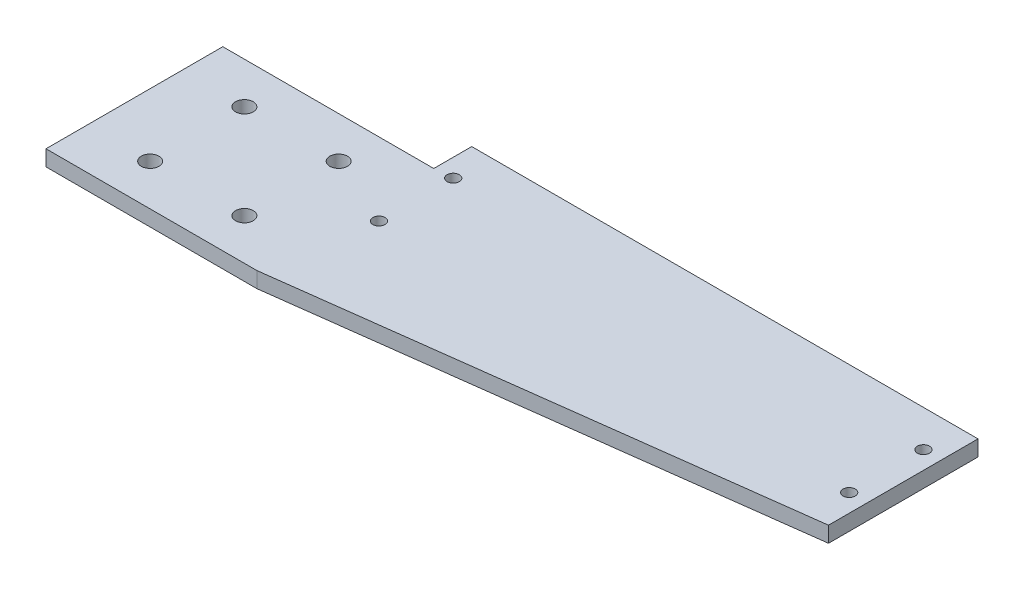
ISO-10303-21;
HEADER;
FILE_DESCRIPTION(('STEP AP214'),'2;1');
FILE_NAME('part.step','',(''),(''),'','','');
FILE_SCHEMA(('AUTOMOTIVE_DESIGN { 1 0 10303 214 1 1 1 1 }'));
ENDSEC;
DATA;
#1=APPLICATION_CONTEXT('core data for automotive mechanical design processes');
#2=APPLICATION_PROTOCOL_DEFINITION('international standard','automotive_design',2000,#1);
#3=PRODUCT_CONTEXT('',#1,'mechanical');
#4=PRODUCT('Part','Part','',(#3));
#5=PRODUCT_RELATED_PRODUCT_CATEGORY('part','',(#4));
#6=PRODUCT_DEFINITION_FORMATION('','',#4);
#7=PRODUCT_DEFINITION_CONTEXT('part definition',#1,'design');
#8=PRODUCT_DEFINITION('design','',#6,#7);
#9=PRODUCT_DEFINITION_SHAPE('','',#8);
#10=(LENGTH_UNIT() NAMED_UNIT(*) SI_UNIT(.MILLI.,.METRE.));
#11=(NAMED_UNIT(*) PLANE_ANGLE_UNIT() SI_UNIT($,.RADIAN.));
#12=(NAMED_UNIT(*) SI_UNIT($,.STERADIAN.) SOLID_ANGLE_UNIT());
#13=UNCERTAINTY_MEASURE_WITH_UNIT(LENGTH_MEASURE(1.E-05),#10,'distance_accuracy_value','');
#14=(GEOMETRIC_REPRESENTATION_CONTEXT(3) GLOBAL_UNCERTAINTY_ASSIGNED_CONTEXT((#13)) GLOBAL_UNIT_ASSIGNED_CONTEXT((#10,
#11,#12)) REPRESENTATION_CONTEXT('',''));
#15=CARTESIAN_POINT('',(0.,0.,0.));
#16=DIRECTION('',(0.,0.,1.));
#17=DIRECTION('',(1.,0.,0.));
#18=AXIS2_PLACEMENT_3D('',#15,#16,#17);
#19=CARTESIAN_POINT('',(102.286,31.3499999999993,-45.0608293227095));
#20=DIRECTION('',(-1.,0.,0.));
#21=DIRECTION('',(0.,-1.,0.));
#22=AXIS2_PLACEMENT_3D('',#19,#20,#21);
#23=PLANE('',#22);
#24=DIRECTION('',(0.,0.,-1.));
#25=VECTOR('',#24,1.);
#26=CARTESIAN_POINT('',(102.286,31.3499999999991,-0.793749999999887));
#27=LINE('',#26,#25);
#28=CARTESIAN_POINT('',(102.286,31.35,1.12088089124449E-13));
#29=VERTEX_POINT('',#28);
#30=CARTESIAN_POINT('',(102.286,31.3499999999994,-60.40625));
#31=VERTEX_POINT('',#30);
#32=EDGE_CURVE('E71',#29,#31,#27,.T.);
#33=ORIENTED_EDGE('',*,*,#32,.F.);
#34=DIRECTION('',(0.,-1.,0.));
#35=VECTOR('',#34,1.);
#36=CARTESIAN_POINT('',(102.286,31.35,1.12088089124449E-13));
#37=LINE('',#36,#35);
#38=CARTESIAN_POINT('',(102.286,24.9999999999991,0.));
#39=VERTEX_POINT('',#38);
#40=EDGE_CURVE('E154',#29,#39,#37,.T.);
#41=ORIENTED_EDGE('',*,*,#40,.T.);
#42=DIRECTION('',(0.,0.,-1.));
#43=VECTOR('',#42,1.);
#44=CARTESIAN_POINT('',(102.286,24.9999999999993,-45.0608293227096));
#45=LINE('',#44,#43);
#46=CARTESIAN_POINT('',(102.286,24.9999999999993,-60.40625));
#47=VERTEX_POINT('',#46);
#48=EDGE_CURVE('E110',#39,#47,#45,.T.);
#49=ORIENTED_EDGE('',*,*,#48,.T.);
#50=DIRECTION('',(0.,-1.,0.));
#51=VECTOR('',#50,1.);
#52=CARTESIAN_POINT('',(102.286,31.3499999999994,-60.40625));
#53=LINE('',#52,#51);
#54=EDGE_CURVE('E25',#31,#47,#53,.T.);
#55=ORIENTED_EDGE('',*,*,#54,.F.);
#56=EDGE_LOOP('',(#33,#41,#49,#55));
#57=FACE_BOUND('',#56,.T.);
#58=ADVANCED_FACE('F17',(#57),#23,.F.);
#59=CARTESIAN_POINT('',(102.286,31.3499999999994,-60.40625));
#60=DIRECTION('',(0.,0.,1.));
#61=DIRECTION('',(0.,-1.,0.));
#62=AXIS2_PLACEMENT_3D('',#59,#60,#61);
#63=PLANE('',#62);
#64=DIRECTION('',(-1.,0.,0.));
#65=VECTOR('',#64,1.);
#66=CARTESIAN_POINT('',(102.286,24.9999999999993,-60.40625));
#67=LINE('',#66,#65);
#68=CARTESIAN_POINT('',(-102.286,24.9999999999993,-60.40625));
#69=VERTEX_POINT('',#68);
#70=EDGE_CURVE('E112',#47,#69,#67,.T.);
#71=ORIENTED_EDGE('',*,*,#70,.T.);
#72=DIRECTION('',(0.,-1.,0.));
#73=VECTOR('',#72,1.);
#74=CARTESIAN_POINT('',(-102.286,31.3499999999993,-60.40625));
#75=LINE('',#74,#73);
#76=CARTESIAN_POINT('',(-102.286,31.3499999999993,-60.40625));
#77=VERTEX_POINT('',#76);
#78=EDGE_CURVE('E99',#77,#69,#75,.T.);
#79=ORIENTED_EDGE('',*,*,#78,.F.);
#80=DIRECTION('',(-1.,0.,0.));
#81=VECTOR('',#80,1.);
#82=CARTESIAN_POINT('',(102.286,31.3499999999994,-60.40625));
#83=LINE('',#82,#81);
#84=EDGE_CURVE('E86',#31,#77,#83,.T.);
#85=ORIENTED_EDGE('',*,*,#84,.F.);
#86=ORIENTED_EDGE('',*,*,#54,.T.);
#87=EDGE_LOOP('',(#71,#79,#85,#86));
#88=FACE_BOUND('',#87,.T.);
#89=ADVANCED_FACE('F227',(#88),#63,.F.);
#90=CARTESIAN_POINT('',(-102.286,31.3499999999993,-45.0608293227095));
#91=DIRECTION('',(1.,0.,0.));
#92=DIRECTION('',(0.,1.,0.));
#93=AXIS2_PLACEMENT_3D('',#90,#91,#92);
#94=PLANE('',#93);
#95=DIRECTION('',(0.,0.,1.));
#96=VECTOR('',#95,1.);
#97=CARTESIAN_POINT('',(-102.286,24.9999999999992,-45.0608293227096));
#98=LINE('',#97,#96);
#99=CARTESIAN_POINT('',(-102.286,24.9999999999992,-45.0608293227096));
#100=VERTEX_POINT('',#99);
#101=EDGE_CURVE('E95',#69,#100,#98,.T.);
#102=ORIENTED_EDGE('',*,*,#101,.T.);
#103=DIRECTION('',(0.,-1.,0.));
#104=VECTOR('',#103,1.);
#105=CARTESIAN_POINT('',(-102.286,31.3499999999993,-45.0608293227095));
#106=LINE('',#105,#104);
#107=CARTESIAN_POINT('',(-102.286,31.3499999999993,-45.0608293227095));
#108=VERTEX_POINT('',#107);
#109=EDGE_CURVE('E92',#108,#100,#106,.T.);
#110=ORIENTED_EDGE('',*,*,#109,.F.);
#111=DIRECTION('',(0.,0.,1.));
#112=VECTOR('',#111,1.);
#113=CARTESIAN_POINT('',(-102.286,31.3499999999993,-45.0608293227095));
#114=LINE('',#113,#112);
#115=EDGE_CURVE('E78',#77,#108,#114,.T.);
#116=ORIENTED_EDGE('',*,*,#115,.F.);
#117=ORIENTED_EDGE('',*,*,#78,.T.);
#118=EDGE_LOOP('',(#102,#110,#116,#117));
#119=FACE_BOUND('',#118,.T.);
#120=ADVANCED_FACE('F93',(#119),#94,.F.);
#121=CARTESIAN_POINT('',(-102.286,31.3499999999993,-45.0608293227095));
#122=DIRECTION('',(0.,0.,1.));
#123=DIRECTION('',(0.,-1.,0.));
#124=AXIS2_PLACEMENT_3D('',#121,#122,#123);
#125=PLANE('',#124);
#126=DIRECTION('',(-1.,0.,0.));
#127=VECTOR('',#126,1.);
#128=CARTESIAN_POINT('',(-102.286,24.9999999999992,-45.0608293227096));
#129=LINE('',#128,#127);
#130=CARTESIAN_POINT('',(-187.528095651979,24.9999999999992,-45.0608293227095));
#131=VERTEX_POINT('',#130);
#132=EDGE_CURVE('E116',#100,#131,#129,.T.);
#133=ORIENTED_EDGE('',*,*,#132,.T.);
#134=DIRECTION('',(0.,-1.,0.));
#135=VECTOR('',#134,1.);
#136=CARTESIAN_POINT('',(-187.528095651979,31.3499999999993,-45.0608293227095));
#137=LINE('',#136,#135);
#138=CARTESIAN_POINT('',(-187.528095651979,31.3499999999993,-45.0608293227095));
#139=VERTEX_POINT('',#138);
#140=EDGE_CURVE('E100',#139,#131,#137,.T.);
#141=ORIENTED_EDGE('',*,*,#140,.F.);
#142=DIRECTION('',(-1.,0.,0.));
#143=VECTOR('',#142,1.);
#144=CARTESIAN_POINT('',(-102.286,31.3499999999993,-45.0608293227095));
#145=LINE('',#144,#143);
#146=EDGE_CURVE('E83',#108,#139,#145,.T.);
#147=ORIENTED_EDGE('',*,*,#146,.F.);
#148=ORIENTED_EDGE('',*,*,#109,.T.);
#149=EDGE_LOOP('',(#133,#141,#147,#148));
#150=FACE_BOUND('',#149,.T.);
#151=ADVANCED_FACE('F102',(#150),#125,.F.);
#152=CARTESIAN_POINT('',(-187.528095651979,31.3499999999991,-0.793749999999851));
#153=DIRECTION('',(1.,0.,0.));
#154=DIRECTION('',(0.,1.,0.));
#155=AXIS2_PLACEMENT_3D('',#152,#153,#154);
#156=PLANE('',#155);
#157=DIRECTION('',(0.,0.,1.));
#158=VECTOR('',#157,1.);
#159=CARTESIAN_POINT('',(-187.528095651979,24.9999999999991,-0.793749999999873));
#160=LINE('',#159,#158);
#161=CARTESIAN_POINT('',(-187.528095651979,24.999999999999,26.3766706772902));
#162=VERTEX_POINT('',#161);
#163=EDGE_CURVE('E63',#131,#162,#160,.T.);
#164=ORIENTED_EDGE('',*,*,#163,.T.);
#165=DIRECTION('',(0.,-1.,0.));
#166=VECTOR('',#165,1.);
#167=CARTESIAN_POINT('',(-187.528095651979,31.349999999999,26.3766706772903));
#168=LINE('',#167,#166);
#169=CARTESIAN_POINT('',(-187.528095651979,31.349999999999,26.3766706772903));
#170=VERTEX_POINT('',#169);
#171=EDGE_CURVE('E109',#170,#162,#168,.T.);
#172=ORIENTED_EDGE('',*,*,#171,.F.);
#173=DIRECTION('',(0.,0.,1.));
#174=VECTOR('',#173,1.);
#175=CARTESIAN_POINT('',(-187.528095651979,31.3499999999991,-0.793749999999851));
#176=LINE('',#175,#174);
#177=EDGE_CURVE('E40',#139,#170,#176,.T.);
#178=ORIENTED_EDGE('',*,*,#177,.F.);
#179=ORIENTED_EDGE('',*,*,#140,.T.);
#180=EDGE_LOOP('',(#164,#172,#178,#179));
#181=FACE_BOUND('',#180,.T.);
#182=ADVANCED_FACE('F241',(#181),#156,.F.);
#183=CARTESIAN_POINT('',(-187.528095651979,31.349999999999,26.3766706772903));
#184=DIRECTION('',(0.,0.,-1.));
#185=DIRECTION('',(0.,1.,0.));
#186=AXIS2_PLACEMENT_3D('',#183,#184,#185);
#187=PLANE('',#186);
#188=DIRECTION('',(1.,0.,0.));
#189=VECTOR('',#188,1.);
#190=CARTESIAN_POINT('',(-187.528095651979,24.999999999999,26.3766706772902));
#191=LINE('',#190,#189);
#192=CARTESIAN_POINT('',(-102.285847501216,24.999999999999,26.3766706772902));
#193=VERTEX_POINT('',#192);
#194=EDGE_CURVE('E119',#162,#193,#191,.T.);
#195=ORIENTED_EDGE('',*,*,#194,.T.);
#196=DIRECTION('',(0.,-1.,0.));
#197=VECTOR('',#196,1.);
#198=CARTESIAN_POINT('',(-102.285847501216,31.3499999999996,26.3766706772902));
#199=LINE('',#198,#197);
#200=CARTESIAN_POINT('',(-102.285847501216,31.3499999999996,26.3766706772902));
#201=VERTEX_POINT('',#200);
#202=EDGE_CURVE('E32',#201,#193,#199,.T.);
#203=ORIENTED_EDGE('',*,*,#202,.F.);
#204=DIRECTION('',(1.,0.,0.));
#205=VECTOR('',#204,1.);
#206=CARTESIAN_POINT('',(-187.528095651979,31.349999999999,26.3766706772903));
#207=LINE('',#206,#205);
#208=EDGE_CURVE('E104',#170,#201,#207,.T.);
#209=ORIENTED_EDGE('',*,*,#208,.F.);
#210=ORIENTED_EDGE('',*,*,#171,.T.);
#211=EDGE_LOOP('',(#195,#203,#209,#210));
#212=FACE_BOUND('',#211,.T.);
#213=ADVANCED_FACE('F145',(#212),#187,.F.);
#214=CARTESIAN_POINT('',(0.,31.3499999999991,1.11555347589728E-13));
#215=DIRECTION('',(0.,1.,0.));
#216=DIRECTION('',(0.,0.,1.));
#217=AXIS2_PLACEMENT_3D('',#214,#215,#216);
#218=PLANE('',#217);
#219=DIRECTION('',(0.991789981983927,0.,-0.127877408623736));
#220=VECTOR('',#219,1.);
#221=CARTESIAN_POINT('',(-102.285847501216,31.3499999999996,26.3766706772902));
#222=LINE('',#221,#220);
#223=EDGE_CURVE('E161',#201,#29,#222,.T.);
#224=ORIENTED_EDGE('',*,*,#223,.T.);
#225=ORIENTED_EDGE('',*,*,#32,.T.);
#226=ORIENTED_EDGE('',*,*,#84,.T.);
#227=ORIENTED_EDGE('',*,*,#115,.T.);
#228=ORIENTED_EDGE('',*,*,#146,.T.);
#229=ORIENTED_EDGE('',*,*,#177,.T.);
#230=ORIENTED_EDGE('',*,*,#208,.T.);
#231=EDGE_LOOP('',(#224,#225,#226,#227,#228,#229,#230));
#232=FACE_BOUND('',#231,.T.);
#233=CARTESIAN_POINT('',(95.0363524987838,31.3499999999996,-45.6000000329997));
#234=DIRECTION('',(0.,-1.,0.));
#235=DIRECTION('',(0.,0.,-1.));
#236=AXIS2_PLACEMENT_3D('',#233,#234,#235);
#237=CIRCLE('',#236,2.46379999999621);
#238=CARTESIAN_POINT('',(95.0363524987838,31.3499999999997,-48.0638000329959));
#239=VERTEX_POINT('',#238);
#240=EDGE_CURVE('E167',#239,#239,#237,.T.);
#241=ORIENTED_EDGE('',*,*,#240,.T.);
#242=EDGE_LOOP('',(#241));
#243=FACE_BOUND('',#242,.T.);
#244=CARTESIAN_POINT('',(-94.9636475012162,31.3499999999995,-15.5999999669998));
#245=DIRECTION('',(0.,-1.,0.));
#246=DIRECTION('',(0.,0.,-1.));
#247=AXIS2_PLACEMENT_3D('',#244,#245,#246);
#248=CIRCLE('',#247,2.46379999999622);
#249=CARTESIAN_POINT('',(-94.9636475012162,31.3499999999995,-18.0637999669961));
#250=VERTEX_POINT('',#249);
#251=EDGE_CURVE('E159',#250,#250,#248,.T.);
#252=ORIENTED_EDGE('',*,*,#251,.T.);
#253=EDGE_LOOP('',(#252));
#254=FACE_BOUND('',#253,.T.);
#255=CARTESIAN_POINT('',(-94.9636475012162,31.3499999999996,-45.6000000329998));
#256=DIRECTION('',(0.,-1.,0.));
#257=DIRECTION('',(0.,0.,-1.));
#258=AXIS2_PLACEMENT_3D('',#255,#256,#257);
#259=CIRCLE('',#258,2.46379999999621);
#260=CARTESIAN_POINT('',(-94.9636475012162,31.3499999999996,-48.063800032996));
#261=VERTEX_POINT('',#260);
#262=EDGE_CURVE('E156',#261,#261,#259,.T.);
#263=ORIENTED_EDGE('',*,*,#262,.T.);
#264=EDGE_LOOP('',(#263));
#265=FACE_BOUND('',#264,.T.);
#266=CARTESIAN_POINT('',(95.0363524987838,31.3499999999996,-15.6000000329997));
#267=DIRECTION('',(0.,-1.,0.));
#268=DIRECTION('',(0.,0.,-1.));
#269=AXIS2_PLACEMENT_3D('',#266,#267,#268);
#270=CIRCLE('',#269,2.46379999999621);
#271=CARTESIAN_POINT('',(95.0363524987838,31.3499999999996,-18.0638000329959));
#272=VERTEX_POINT('',#271);
#273=EDGE_CURVE('E139',#272,#272,#270,.T.);
#274=ORIENTED_EDGE('',*,*,#273,.T.);
#275=EDGE_LOOP('',(#274));
#276=FACE_BOUND('',#275,.T.);
#277=CARTESIAN_POINT('',(-162.128095651979,31.3499999999992,-28.3883293227097));
#278=DIRECTION('',(0.,1.,0.));
#279=DIRECTION('',(0.,0.,1.));
#280=AXIS2_PLACEMENT_3D('',#277,#278,#279);
#281=CIRCLE('',#280,3.5687);
#282=CARTESIAN_POINT('',(-162.128095651979,31.3499999999992,-24.8196293227097));
#283=VERTEX_POINT('',#282);
#284=EDGE_CURVE('E113',#283,#283,#281,.T.);
#285=ORIENTED_EDGE('',*,*,#284,.F.);
#286=EDGE_LOOP('',(#285));
#287=FACE_BOUND('',#286,.T.);
#288=CARTESIAN_POINT('',(-162.128095651979,31.3499999999991,9.71167067729029));
#289=DIRECTION('',(0.,1.,0.));
#290=DIRECTION('',(0.,0.,1.));
#291=AXIS2_PLACEMENT_3D('',#288,#289,#290);
#292=CIRCLE('',#291,3.5687);
#293=CARTESIAN_POINT('',(-162.128095651979,31.349999999999,13.2803706772903));
#294=VERTEX_POINT('',#293);
#295=EDGE_CURVE('E191',#294,#294,#292,.T.);
#296=ORIENTED_EDGE('',*,*,#295,.F.);
#297=EDGE_LOOP('',(#296));
#298=FACE_BOUND('',#297,.T.);
#299=CARTESIAN_POINT('',(-124.02809565198,31.3499999999991,9.71167067729029));
#300=DIRECTION('',(0.,1.,0.));
#301=DIRECTION('',(0.,0.,1.));
#302=AXIS2_PLACEMENT_3D('',#299,#300,#301);
#303=CIRCLE('',#302,3.56870000000008);
#304=CARTESIAN_POINT('',(-124.02809565198,31.349999999999,13.2803706772904));
#305=VERTEX_POINT('',#304);
#306=EDGE_CURVE('E188',#305,#305,#303,.T.);
#307=ORIENTED_EDGE('',*,*,#306,.F.);
#308=EDGE_LOOP('',(#307));
#309=FACE_BOUND('',#308,.T.);
#310=CARTESIAN_POINT('',(-124.02809565198,31.3499999999992,-28.3883293227097));
#311=DIRECTION('',(0.,1.,0.));
#312=DIRECTION('',(0.,0.,1.));
#313=AXIS2_PLACEMENT_3D('',#310,#311,#312);
#314=CIRCLE('',#313,3.5687);
#315=CARTESIAN_POINT('',(-124.02809565198,31.3499999999992,-24.8196293227097));
#316=VERTEX_POINT('',#315);
#317=EDGE_CURVE('E185',#316,#316,#314,.T.);
#318=ORIENTED_EDGE('',*,*,#317,.F.);
#319=EDGE_LOOP('',(#318));
#320=FACE_BOUND('',#319,.T.);
#321=ADVANCED_FACE('F80',(#232,#243,#254,#265,#276,#287,#298,#309,#320),#218,.T.);
#322=CARTESIAN_POINT('',(0.,24.9999999999991,0.));
#323=DIRECTION('',(0.,1.,0.));
#324=DIRECTION('',(0.,0.,1.));
#325=AXIS2_PLACEMENT_3D('',#322,#323,#324);
#326=PLANE('',#325);
#327=CARTESIAN_POINT('',(95.0363524987838,24.9999999999993,-45.6000000329997));
#328=DIRECTION('',(0.,1.,0.));
#329=DIRECTION('',(0.,0.,1.));
#330=AXIS2_PLACEMENT_3D('',#327,#328,#329);
#331=CIRCLE('',#330,2.46379999999621);
#332=CARTESIAN_POINT('',(95.0363524987838,24.9999999999993,-43.1362000330035));
#333=VERTEX_POINT('',#332);
#334=EDGE_CURVE('E126',#333,#333,#331,.T.);
#335=ORIENTED_EDGE('',*,*,#334,.T.);
#336=EDGE_LOOP('',(#335));
#337=FACE_BOUND('',#336,.T.);
#338=CARTESIAN_POINT('',(-94.9636475012162,24.9999999999992,-15.5999999669998));
#339=DIRECTION('',(0.,1.,0.));
#340=DIRECTION('',(0.,0.,1.));
#341=AXIS2_PLACEMENT_3D('',#338,#339,#340);
#342=CIRCLE('',#341,2.46379999999622);
#343=CARTESIAN_POINT('',(-94.9636475012162,24.9999999999991,-13.1361999670036));
#344=VERTEX_POINT('',#343);
#345=EDGE_CURVE('E130',#344,#344,#342,.T.);
#346=ORIENTED_EDGE('',*,*,#345,.T.);
#347=EDGE_LOOP('',(#346));
#348=FACE_BOUND('',#347,.T.);
#349=CARTESIAN_POINT('',(-94.9636475012162,24.9999999999992,-45.6000000329999));
#350=DIRECTION('',(0.,1.,0.));
#351=DIRECTION('',(0.,0.,1.));
#352=AXIS2_PLACEMENT_3D('',#349,#350,#351);
#353=CIRCLE('',#352,2.46379999999621);
#354=CARTESIAN_POINT('',(-94.9636475012162,24.9999999999992,-43.1362000330037));
#355=VERTEX_POINT('',#354);
#356=EDGE_CURVE('E133',#355,#355,#353,.T.);
#357=ORIENTED_EDGE('',*,*,#356,.T.);
#358=EDGE_LOOP('',(#357));
#359=FACE_BOUND('',#358,.T.);
#360=CARTESIAN_POINT('',(95.0363524987838,24.9999999999992,-15.6000000329997));
#361=DIRECTION('',(0.,1.,0.));
#362=DIRECTION('',(0.,0.,1.));
#363=AXIS2_PLACEMENT_3D('',#360,#361,#362);
#364=CIRCLE('',#363,2.46379999999621);
#365=CARTESIAN_POINT('',(95.0363524987838,24.9999999999992,-13.1362000330035));
#366=VERTEX_POINT('',#365);
#367=EDGE_CURVE('E136',#366,#366,#364,.T.);
#368=ORIENTED_EDGE('',*,*,#367,.T.);
#369=EDGE_LOOP('',(#368));
#370=FACE_BOUND('',#369,.T.);
#371=CARTESIAN_POINT('',(-162.128095651979,24.9999999999988,-28.3883293227098));
#372=DIRECTION('',(0.,1.,0.));
#373=DIRECTION('',(0.,0.,1.));
#374=AXIS2_PLACEMENT_3D('',#371,#372,#373);
#375=CIRCLE('',#374,3.5687);
#376=CARTESIAN_POINT('',(-162.128095651979,24.9999999999988,-24.8196293227098));
#377=VERTEX_POINT('',#376);
#378=EDGE_CURVE('E129',#377,#377,#375,.T.);
#379=ORIENTED_EDGE('',*,*,#378,.T.);
#380=EDGE_LOOP('',(#379));
#381=FACE_BOUND('',#380,.T.);
#382=CARTESIAN_POINT('',(-162.128095651979,24.9999999999987,9.71167067729026));
#383=DIRECTION('',(0.,1.,0.));
#384=DIRECTION('',(0.,0.,1.));
#385=AXIS2_PLACEMENT_3D('',#382,#383,#384);
#386=CIRCLE('',#385,3.5687);
#387=CARTESIAN_POINT('',(-162.128095651979,24.9999999999987,13.2803706772903));
#388=VERTEX_POINT('',#387);
#389=EDGE_CURVE('E178',#388,#388,#386,.T.);
#390=ORIENTED_EDGE('',*,*,#389,.T.);
#391=EDGE_LOOP('',(#390));
#392=FACE_BOUND('',#391,.T.);
#393=CARTESIAN_POINT('',(-124.02809565198,24.9999999999987,9.71167067729027));
#394=DIRECTION('',(0.,1.,0.));
#395=DIRECTION('',(0.,0.,1.));
#396=AXIS2_PLACEMENT_3D('',#393,#394,#395);
#397=CIRCLE('',#396,3.56870000000008);
#398=CARTESIAN_POINT('',(-124.02809565198,24.9999999999987,13.2803706772903));
#399=VERTEX_POINT('',#398);
#400=EDGE_CURVE('E174',#399,#399,#397,.T.);
#401=ORIENTED_EDGE('',*,*,#400,.T.);
#402=EDGE_LOOP('',(#401));
#403=FACE_BOUND('',#402,.T.);
#404=CARTESIAN_POINT('',(-124.02809565198,24.9999999999988,-28.3883293227098));
#405=DIRECTION('',(0.,1.,0.));
#406=DIRECTION('',(0.,0.,1.));
#407=AXIS2_PLACEMENT_3D('',#404,#405,#406);
#408=CIRCLE('',#407,3.5687);
#409=CARTESIAN_POINT('',(-124.02809565198,24.9999999999988,-24.8196293227098));
#410=VERTEX_POINT('',#409);
#411=EDGE_CURVE('E177',#410,#410,#408,.T.);
#412=ORIENTED_EDGE('',*,*,#411,.T.);
#413=EDGE_LOOP('',(#412));
#414=FACE_BOUND('',#413,.T.);
#415=ORIENTED_EDGE('',*,*,#48,.F.);
#416=DIRECTION('',(-0.991789981983927,0.,0.127877408623736));
#417=VECTOR('',#416,1.);
#418=CARTESIAN_POINT('',(1.67264527955281,24.9999999999991,12.9726810194783));
#419=LINE('',#418,#417);
#420=EDGE_CURVE('E11',#39,#193,#419,.T.);
#421=ORIENTED_EDGE('',*,*,#420,.T.);
#422=ORIENTED_EDGE('',*,*,#194,.F.);
#423=ORIENTED_EDGE('',*,*,#163,.F.);
#424=ORIENTED_EDGE('',*,*,#132,.F.);
#425=ORIENTED_EDGE('',*,*,#101,.F.);
#426=ORIENTED_EDGE('',*,*,#70,.F.);
#427=EDGE_LOOP('',(#415,#421,#422,#423,#424,#425,#426));
#428=FACE_BOUND('',#427,.T.);
#429=ADVANCED_FACE('F148',(#337,#348,#359,#370,#381,#392,#403,#414,#428),#326,.F.);
#430=CARTESIAN_POINT('',(-124.02809565198,24.9999999999988,-28.3883293227098));
#431=DIRECTION('',(0.,1.,0.));
#432=DIRECTION('',(0.,0.,1.));
#433=AXIS2_PLACEMENT_3D('',#430,#431,#432);
#434=CYLINDRICAL_SURFACE('',#433,3.5687);
#435=ORIENTED_EDGE('',*,*,#317,.T.);
#436=EDGE_LOOP('',(#435));
#437=FACE_BOUND('',#436,.T.);
#438=ORIENTED_EDGE('',*,*,#411,.F.);
#439=EDGE_LOOP('',(#438));
#440=FACE_BOUND('',#439,.T.);
#441=ADVANCED_FACE('F210',(#437,#440),#434,.F.);
#442=CARTESIAN_POINT('',(-124.02809565198,24.9999999999987,9.71167067729027));
#443=DIRECTION('',(0.,1.,0.));
#444=DIRECTION('',(0.,0.,1.));
#445=AXIS2_PLACEMENT_3D('',#442,#443,#444);
#446=CYLINDRICAL_SURFACE('',#445,3.56870000000008);
#447=ORIENTED_EDGE('',*,*,#306,.T.);
#448=EDGE_LOOP('',(#447));
#449=FACE_BOUND('',#448,.T.);
#450=ORIENTED_EDGE('',*,*,#400,.F.);
#451=EDGE_LOOP('',(#450));
#452=FACE_BOUND('',#451,.T.);
#453=ADVANCED_FACE('F213',(#449,#452),#446,.F.);
#454=CARTESIAN_POINT('',(-162.128095651979,24.9999999999987,9.71167067729026));
#455=DIRECTION('',(0.,1.,0.));
#456=DIRECTION('',(0.,0.,1.));
#457=AXIS2_PLACEMENT_3D('',#454,#455,#456);
#458=CYLINDRICAL_SURFACE('',#457,3.5687);
#459=ORIENTED_EDGE('',*,*,#295,.T.);
#460=EDGE_LOOP('',(#459));
#461=FACE_BOUND('',#460,.T.);
#462=ORIENTED_EDGE('',*,*,#389,.F.);
#463=EDGE_LOOP('',(#462));
#464=FACE_BOUND('',#463,.T.);
#465=ADVANCED_FACE('F278',(#461,#464),#458,.F.);
#466=CARTESIAN_POINT('',(-162.128095651979,24.9999999999988,-28.3883293227098));
#467=DIRECTION('',(0.,1.,0.));
#468=DIRECTION('',(0.,0.,1.));
#469=AXIS2_PLACEMENT_3D('',#466,#467,#468);
#470=CYLINDRICAL_SURFACE('',#469,3.5687);
#471=ORIENTED_EDGE('',*,*,#284,.T.);
#472=EDGE_LOOP('',(#471));
#473=FACE_BOUND('',#472,.T.);
#474=ORIENTED_EDGE('',*,*,#378,.F.);
#475=EDGE_LOOP('',(#474));
#476=FACE_BOUND('',#475,.T.);
#477=ADVANCED_FACE('F198',(#473,#476),#470,.F.);
#478=CARTESIAN_POINT('',(95.0363524987838,31.3499999999996,-15.6000000329997));
#479=DIRECTION('',(0.,-1.,0.));
#480=DIRECTION('',(0.,0.,-1.));
#481=AXIS2_PLACEMENT_3D('',#478,#479,#480);
#482=CYLINDRICAL_SURFACE('',#481,2.46379999999621);
#483=ORIENTED_EDGE('',*,*,#273,.F.);
#484=EDGE_LOOP('',(#483));
#485=FACE_BOUND('',#484,.T.);
#486=ORIENTED_EDGE('',*,*,#367,.F.);
#487=EDGE_LOOP('',(#486));
#488=FACE_BOUND('',#487,.T.);
#489=ADVANCED_FACE('F297',(#485,#488),#482,.F.);
#490=CARTESIAN_POINT('',(-94.9636475012162,31.3499999999996,-45.6000000329998));
#491=DIRECTION('',(0.,-1.,0.));
#492=DIRECTION('',(0.,0.,-1.));
#493=AXIS2_PLACEMENT_3D('',#490,#491,#492);
#494=CYLINDRICAL_SURFACE('',#493,2.46379999999621);
#495=ORIENTED_EDGE('',*,*,#262,.F.);
#496=EDGE_LOOP('',(#495));
#497=FACE_BOUND('',#496,.T.);
#498=ORIENTED_EDGE('',*,*,#356,.F.);
#499=EDGE_LOOP('',(#498));
#500=FACE_BOUND('',#499,.T.);
#501=ADVANCED_FACE('F306',(#497,#500),#494,.F.);
#502=CARTESIAN_POINT('',(-94.9636475012162,31.3499999999995,-15.5999999669998));
#503=DIRECTION('',(0.,-1.,0.));
#504=DIRECTION('',(0.,0.,-1.));
#505=AXIS2_PLACEMENT_3D('',#502,#503,#504);
#506=CYLINDRICAL_SURFACE('',#505,2.46379999999622);
#507=ORIENTED_EDGE('',*,*,#251,.F.);
#508=EDGE_LOOP('',(#507));
#509=FACE_BOUND('',#508,.T.);
#510=ORIENTED_EDGE('',*,*,#345,.F.);
#511=EDGE_LOOP('',(#510));
#512=FACE_BOUND('',#511,.T.);
#513=ADVANCED_FACE('F316',(#509,#512),#506,.F.);
#514=CARTESIAN_POINT('',(95.0363524987838,31.3499999999996,-45.6000000329997));
#515=DIRECTION('',(0.,-1.,0.));
#516=DIRECTION('',(0.,0.,-1.));
#517=AXIS2_PLACEMENT_3D('',#514,#515,#516);
#518=CYLINDRICAL_SURFACE('',#517,2.46379999999621);
#519=ORIENTED_EDGE('',*,*,#240,.F.);
#520=EDGE_LOOP('',(#519));
#521=FACE_BOUND('',#520,.T.);
#522=ORIENTED_EDGE('',*,*,#334,.F.);
#523=EDGE_LOOP('',(#522));
#524=FACE_BOUND('',#523,.T.);
#525=ADVANCED_FACE('F326',(#521,#524),#518,.F.);
#526=CARTESIAN_POINT('',(-102.285847501216,31.3499999999996,26.3766706772902));
#527=DIRECTION('',(-0.127877408623736,0.,-0.991789981983927));
#528=DIRECTION('',(-0.991789981983927,0.,0.127877408623736));
#529=AXIS2_PLACEMENT_3D('',#526,#527,#528);
#530=PLANE('',#529);
#531=ORIENTED_EDGE('',*,*,#40,.F.);
#532=ORIENTED_EDGE('',*,*,#223,.F.);
#533=ORIENTED_EDGE('',*,*,#202,.T.);
#534=ORIENTED_EDGE('',*,*,#420,.F.);
#535=EDGE_LOOP('',(#531,#532,#533,#534));
#536=FACE_BOUND('',#535,.T.);
#537=ADVANCED_FACE('F152',(#536),#530,.F.);
#538=CLOSED_SHELL('',(#58,#89,#120,#151,#182,#213,#321,#429,#441,#453,#465,#477,#489,#501,#513,
#525,#537));
#539=MANIFOLD_SOLID_BREP('B1',#538);
#540=ADVANCED_BREP_SHAPE_REPRESENTATION('',(#18,#539),#14);
#541=SHAPE_DEFINITION_REPRESENTATION(#9,#540);
ENDSEC;
END-ISO-10303-21;
